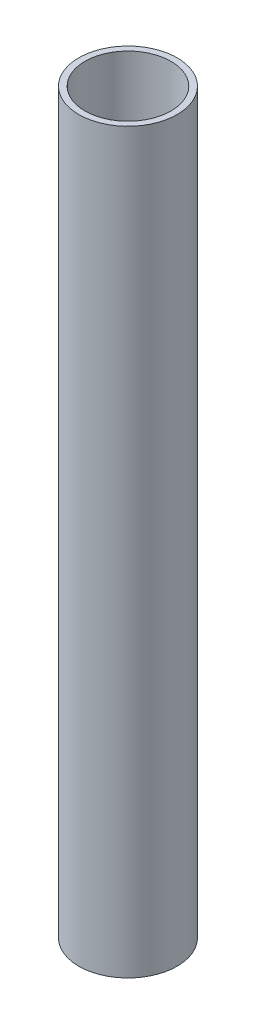
ISO-10303-21;
HEADER;
FILE_DESCRIPTION(('STEP AP214'),'2;1');
FILE_NAME('part.step','',(''),(''),'','','');
FILE_SCHEMA(('AUTOMOTIVE_DESIGN { 1 0 10303 214 1 1 1 1 }'));
ENDSEC;
DATA;
#1=APPLICATION_CONTEXT('core data for automotive mechanical design processes');
#2=APPLICATION_PROTOCOL_DEFINITION('international standard','automotive_design',2000,#1);
#3=PRODUCT_CONTEXT('',#1,'mechanical');
#4=PRODUCT('Part','Part','',(#3));
#5=PRODUCT_RELATED_PRODUCT_CATEGORY('part','',(#4));
#6=PRODUCT_DEFINITION_FORMATION('','',#4);
#7=PRODUCT_DEFINITION_CONTEXT('part definition',#1,'design');
#8=PRODUCT_DEFINITION('design','',#6,#7);
#9=PRODUCT_DEFINITION_SHAPE('','',#8);
#10=(LENGTH_UNIT() NAMED_UNIT(*) SI_UNIT(.MILLI.,.METRE.));
#11=(NAMED_UNIT(*) PLANE_ANGLE_UNIT() SI_UNIT($,.RADIAN.));
#12=(NAMED_UNIT(*) SI_UNIT($,.STERADIAN.) SOLID_ANGLE_UNIT());
#13=UNCERTAINTY_MEASURE_WITH_UNIT(LENGTH_MEASURE(1.E-05),#10,'distance_accuracy_value','');
#14=(GEOMETRIC_REPRESENTATION_CONTEXT(3) GLOBAL_UNCERTAINTY_ASSIGNED_CONTEXT((#13)) GLOBAL_UNIT_ASSIGNED_CONTEXT((#10,
#11,#12)) REPRESENTATION_CONTEXT('',''));
#15=CARTESIAN_POINT('',(0.,0.,0.));
#16=DIRECTION('',(0.,0.,1.));
#17=DIRECTION('',(1.,0.,0.));
#18=AXIS2_PLACEMENT_3D('',#15,#16,#17);
#19=CARTESIAN_POINT('',(0.,120.,0.));
#20=DIRECTION('',(0.,1.,0.));
#21=DIRECTION('',(0.,0.,1.));
#22=AXIS2_PLACEMENT_3D('',#19,#20,#21);
#23=PLANE('',#22);
#24=CARTESIAN_POINT('',(0.,120.,0.));
#25=DIRECTION('',(0.,1.,0.));
#26=DIRECTION('',(0.,0.,1.));
#27=AXIS2_PLACEMENT_3D('',#24,#25,#26);
#28=CIRCLE('',#27,8.);
#29=CARTESIAN_POINT('',(0.,120.,8.));
#30=VERTEX_POINT('',#29);
#31=EDGE_CURVE('E10',#30,#30,#28,.T.);
#32=ORIENTED_EDGE('',*,*,#31,.T.);
#33=EDGE_LOOP('',(#32));
#34=FACE_BOUND('',#33,.T.);
#35=CARTESIAN_POINT('',(0.,120.,0.));
#36=DIRECTION('',(0.,1.,0.));
#37=DIRECTION('',(0.,0.,1.));
#38=AXIS2_PLACEMENT_3D('',#35,#36,#37);
#39=CIRCLE('',#38,7.);
#40=CARTESIAN_POINT('',(0.,120.,7.));
#41=VERTEX_POINT('',#40);
#42=EDGE_CURVE('E52',#41,#41,#39,.T.);
#43=ORIENTED_EDGE('',*,*,#42,.F.);
#44=EDGE_LOOP('',(#43));
#45=FACE_BOUND('',#44,.T.);
#46=ADVANCED_FACE('F39',(#34,#45),#23,.T.);
#47=CARTESIAN_POINT('',(0.,0.,0.));
#48=DIRECTION('',(0.,1.,0.));
#49=DIRECTION('',(0.,0.,1.));
#50=AXIS2_PLACEMENT_3D('',#47,#48,#49);
#51=PLANE('',#50);
#52=CARTESIAN_POINT('',(0.,0.,0.));
#53=DIRECTION('',(0.,1.,0.));
#54=DIRECTION('',(0.,0.,1.));
#55=AXIS2_PLACEMENT_3D('',#52,#53,#54);
#56=CIRCLE('',#55,8.);
#57=CARTESIAN_POINT('',(0.,0.,8.));
#58=VERTEX_POINT('',#57);
#59=EDGE_CURVE('E43',#58,#58,#56,.T.);
#60=ORIENTED_EDGE('',*,*,#59,.F.);
#61=EDGE_LOOP('',(#60));
#62=FACE_BOUND('',#61,.T.);
#63=CARTESIAN_POINT('',(0.,0.,0.));
#64=DIRECTION('',(0.,1.,0.));
#65=DIRECTION('',(0.,0.,1.));
#66=AXIS2_PLACEMENT_3D('',#63,#64,#65);
#67=CIRCLE('',#66,7.);
#68=CARTESIAN_POINT('',(0.,0.,7.));
#69=VERTEX_POINT('',#68);
#70=EDGE_CURVE('E54',#69,#69,#67,.T.);
#71=ORIENTED_EDGE('',*,*,#70,.T.);
#72=EDGE_LOOP('',(#71));
#73=FACE_BOUND('',#72,.T.);
#74=ADVANCED_FACE('F66',(#62,#73),#51,.F.);
#75=CARTESIAN_POINT('',(0.,120.,0.));
#76=DIRECTION('',(0.,-1.,0.));
#77=DIRECTION('',(0.,0.,-1.));
#78=AXIS2_PLACEMENT_3D('',#75,#76,#77);
#79=CYLINDRICAL_SURFACE('',#78,8.);
#80=ORIENTED_EDGE('',*,*,#31,.F.);
#81=EDGE_LOOP('',(#80));
#82=FACE_BOUND('',#81,.T.);
#83=ORIENTED_EDGE('',*,*,#59,.T.);
#84=EDGE_LOOP('',(#83));
#85=FACE_BOUND('',#84,.T.);
#86=ADVANCED_FACE('F41',(#82,#85),#79,.T.);
#87=CARTESIAN_POINT('',(0.,120.,0.));
#88=DIRECTION('',(0.,-1.,0.));
#89=DIRECTION('',(0.,0.,-1.));
#90=AXIS2_PLACEMENT_3D('',#87,#88,#89);
#91=CYLINDRICAL_SURFACE('',#90,7.);
#92=ORIENTED_EDGE('',*,*,#42,.T.);
#93=EDGE_LOOP('',(#92));
#94=FACE_BOUND('',#93,.T.);
#95=ORIENTED_EDGE('',*,*,#70,.F.);
#96=EDGE_LOOP('',(#95));
#97=FACE_BOUND('',#96,.T.);
#98=ADVANCED_FACE('F62',(#94,#97),#91,.F.);
#99=CLOSED_SHELL('',(#46,#74,#86,#98));
#100=MANIFOLD_SOLID_BREP('B2',#99);
#101=ADVANCED_BREP_SHAPE_REPRESENTATION('',(#18,#100),#14);
#102=SHAPE_DEFINITION_REPRESENTATION(#9,#101);
ENDSEC;
END-ISO-10303-21;
